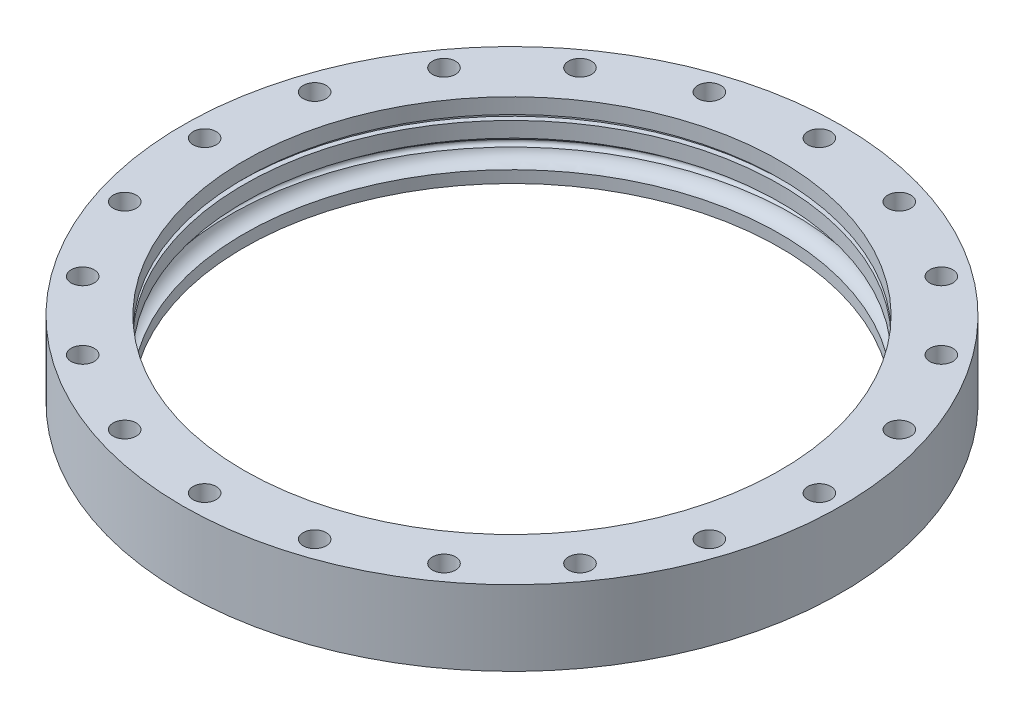
ISO-10303-21;
HEADER;
FILE_DESCRIPTION(('STEP AP214'),'2;1');
FILE_NAME('part.step','',(''),(''),'','','');
FILE_SCHEMA(('AUTOMOTIVE_DESIGN { 1 0 10303 214 1 1 1 1 }'));
ENDSEC;
DATA;
#1=APPLICATION_CONTEXT('core data for automotive mechanical design processes');
#2=APPLICATION_PROTOCOL_DEFINITION('international standard','automotive_design',2000,#1);
#3=PRODUCT_CONTEXT('',#1,'mechanical');
#4=PRODUCT('Part','Part','',(#3));
#5=PRODUCT_RELATED_PRODUCT_CATEGORY('part','',(#4));
#6=PRODUCT_DEFINITION_FORMATION('','',#4);
#7=PRODUCT_DEFINITION_CONTEXT('part definition',#1,'design');
#8=PRODUCT_DEFINITION('design','',#6,#7);
#9=PRODUCT_DEFINITION_SHAPE('','',#8);
#10=(LENGTH_UNIT() NAMED_UNIT(*) SI_UNIT(.MILLI.,.METRE.));
#11=(NAMED_UNIT(*) PLANE_ANGLE_UNIT() SI_UNIT($,.RADIAN.));
#12=(NAMED_UNIT(*) SI_UNIT($,.STERADIAN.) SOLID_ANGLE_UNIT());
#13=UNCERTAINTY_MEASURE_WITH_UNIT(LENGTH_MEASURE(1.E-05),#10,'distance_accuracy_value','');
#14=(GEOMETRIC_REPRESENTATION_CONTEXT(3) GLOBAL_UNCERTAINTY_ASSIGNED_CONTEXT((#13)) GLOBAL_UNIT_ASSIGNED_CONTEXT((#10,
#11,#12)) REPRESENTATION_CONTEXT('',''));
#15=CARTESIAN_POINT('',(0.,0.,0.));
#16=DIRECTION('',(0.,0.,1.));
#17=DIRECTION('',(1.,0.,0.));
#18=AXIS2_PLACEMENT_3D('',#15,#16,#17);
#19=CARTESIAN_POINT('',(0.,15.,0.));
#20=DIRECTION('',(0.,1.,0.));
#21=DIRECTION('',(0.,0.,1.));
#22=AXIS2_PLACEMENT_3D('',#19,#20,#21);
#23=TOROIDAL_SURFACE('',#22,164.5,2.);
#24=CARTESIAN_POINT('',(0.,13.0156865167015,0.));
#25=DIRECTION('',(0.,1.,0.));
#26=DIRECTION('',(0.,0.,1.));
#27=AXIS2_PLACEMENT_3D('',#24,#25,#26);
#28=CIRCLE('',#27,164.75);
#29=CARTESIAN_POINT('',(0.,13.0156865167015,164.75));
#30=VERTEX_POINT('',#29);
#31=EDGE_CURVE('E71',#30,#30,#28,.T.);
#32=ORIENTED_EDGE('',*,*,#31,.F.);
#33=EDGE_LOOP('',(#32));
#34=FACE_BOUND('',#33,.T.);
#35=CARTESIAN_POINT('',(0.,16.9843134832984,0.));
#36=DIRECTION('',(0.,1.,0.));
#37=DIRECTION('',(0.,0.,1.));
#38=AXIS2_PLACEMENT_3D('',#35,#36,#37);
#39=CIRCLE('',#38,164.75);
#40=CARTESIAN_POINT('',(0.,16.9843134832984,164.75));
#41=VERTEX_POINT('',#40);
#42=EDGE_CURVE('E10',#41,#41,#39,.T.);
#43=ORIENTED_EDGE('',*,*,#42,.T.);
#44=EDGE_LOOP('',(#43));
#45=FACE_BOUND('',#44,.T.);
#46=ADVANCED_FACE('F31',(#34,#45),#23,.F.);
#47=CARTESIAN_POINT('',(0.,15.,0.));
#48=DIRECTION('',(0.,1.,0.));
#49=DIRECTION('',(0.,0.,1.));
#50=AXIS2_PLACEMENT_3D('',#47,#48,#49);
#51=TOROIDAL_SURFACE('',#50,157.,8.);
#52=ORIENTED_EDGE('',*,*,#42,.F.);
#53=EDGE_LOOP('',(#52));
#54=FACE_BOUND('',#53,.T.);
#55=CARTESIAN_POINT('',(0.,23.,0.));
#56=DIRECTION('',(0.,1.,0.));
#57=DIRECTION('',(0.,0.,1.));
#58=AXIS2_PLACEMENT_3D('',#55,#56,#57);
#59=CIRCLE('',#58,157.);
#60=CARTESIAN_POINT('',(0.,23.,157.));
#61=VERTEX_POINT('',#60);
#62=EDGE_CURVE('E37',#61,#61,#59,.T.);
#63=ORIENTED_EDGE('',*,*,#62,.T.);
#64=EDGE_LOOP('',(#63));
#65=FACE_BOUND('',#64,.T.);
#66=ADVANCED_FACE('F265',(#54,#65),#51,.F.);
#67=CARTESIAN_POINT('',(0.,44.,0.));
#68=DIRECTION('',(0.,1.,0.));
#69=DIRECTION('',(0.,0.,1.));
#70=AXIS2_PLACEMENT_3D('',#67,#68,#69);
#71=CYLINDRICAL_SURFACE('',#70,157.);
#72=ORIENTED_EDGE('',*,*,#62,.F.);
#73=EDGE_LOOP('',(#72));
#74=FACE_BOUND('',#73,.T.);
#75=CARTESIAN_POINT('',(0.,32.,0.));
#76=DIRECTION('',(0.,1.,0.));
#77=DIRECTION('',(0.,0.,1.));
#78=AXIS2_PLACEMENT_3D('',#75,#76,#77);
#79=CIRCLE('',#78,157.);
#80=CARTESIAN_POINT('',(0.,32.,157.));
#81=VERTEX_POINT('',#80);
#82=EDGE_CURVE('E41',#81,#81,#79,.T.);
#83=ORIENTED_EDGE('',*,*,#82,.T.);
#84=EDGE_LOOP('',(#83));
#85=FACE_BOUND('',#84,.T.);
#86=ADVANCED_FACE('F270',(#74,#85),#71,.F.);
#87=CARTESIAN_POINT('',(0.,32.,0.));
#88=DIRECTION('',(0.,-1.,0.));
#89=DIRECTION('',(0.,0.,-1.));
#90=AXIS2_PLACEMENT_3D('',#87,#88,#89);
#91=PLANE('',#90);
#92=ORIENTED_EDGE('',*,*,#82,.F.);
#93=EDGE_LOOP('',(#92));
#94=FACE_BOUND('',#93,.T.);
#95=CARTESIAN_POINT('',(0.,32.,0.));
#96=DIRECTION('',(0.,1.,0.));
#97=DIRECTION('',(0.,0.,1.));
#98=AXIS2_PLACEMENT_3D('',#95,#96,#97);
#99=CIRCLE('',#98,160.);
#100=CARTESIAN_POINT('',(0.,32.,160.));
#101=VERTEX_POINT('',#100);
#102=EDGE_CURVE('E45',#101,#101,#99,.T.);
#103=ORIENTED_EDGE('',*,*,#102,.T.);
#104=EDGE_LOOP('',(#103));
#105=FACE_BOUND('',#104,.T.);
#106=ADVANCED_FACE('F345',(#94,#105),#91,.F.);
#107=CARTESIAN_POINT('',(0.,44.,0.));
#108=DIRECTION('',(0.,1.,0.));
#109=DIRECTION('',(0.,0.,1.));
#110=AXIS2_PLACEMENT_3D('',#107,#108,#109);
#111=CYLINDRICAL_SURFACE('',#110,160.);
#112=ORIENTED_EDGE('',*,*,#102,.F.);
#113=EDGE_LOOP('',(#112));
#114=FACE_BOUND('',#113,.T.);
#115=CARTESIAN_POINT('',(0.,35.,0.));
#116=DIRECTION('',(0.,1.,0.));
#117=DIRECTION('',(0.,0.,1.));
#118=AXIS2_PLACEMENT_3D('',#115,#116,#117);
#119=CIRCLE('',#118,160.);
#120=CARTESIAN_POINT('',(0.,35.,160.));
#121=VERTEX_POINT('',#120);
#122=EDGE_CURVE('E50',#121,#121,#119,.T.);
#123=ORIENTED_EDGE('',*,*,#122,.T.);
#124=EDGE_LOOP('',(#123));
#125=FACE_BOUND('',#124,.T.);
#126=ADVANCED_FACE('F260',(#114,#125),#111,.F.);
#127=CARTESIAN_POINT('',(0.,35.,0.));
#128=DIRECTION('',(0.,1.,0.));
#129=DIRECTION('',(0.,0.,1.));
#130=AXIS2_PLACEMENT_3D('',#127,#128,#129);
#131=PLANE('',#130);
#132=ORIENTED_EDGE('',*,*,#122,.F.);
#133=EDGE_LOOP('',(#132));
#134=FACE_BOUND('',#133,.T.);
#135=CARTESIAN_POINT('',(0.,35.,0.));
#136=DIRECTION('',(0.,1.,0.));
#137=DIRECTION('',(0.,0.,1.));
#138=AXIS2_PLACEMENT_3D('',#135,#136,#137);
#139=CIRCLE('',#138,157.);
#140=CARTESIAN_POINT('',(0.,35.,157.));
#141=VERTEX_POINT('',#140);
#142=EDGE_CURVE('E53',#141,#141,#139,.T.);
#143=ORIENTED_EDGE('',*,*,#142,.T.);
#144=EDGE_LOOP('',(#143));
#145=FACE_BOUND('',#144,.T.);
#146=ADVANCED_FACE('F254',(#134,#145),#131,.F.);
#147=CARTESIAN_POINT('',(0.,44.,0.));
#148=DIRECTION('',(0.,1.,0.));
#149=DIRECTION('',(0.,0.,1.));
#150=AXIS2_PLACEMENT_3D('',#147,#148,#149);
#151=CYLINDRICAL_SURFACE('',#150,157.);
#152=ORIENTED_EDGE('',*,*,#142,.F.);
#153=EDGE_LOOP('',(#152));
#154=FACE_BOUND('',#153,.T.);
#155=CARTESIAN_POINT('',(0.,44.,0.));
#156=DIRECTION('',(0.,1.,0.));
#157=DIRECTION('',(0.,0.,1.));
#158=AXIS2_PLACEMENT_3D('',#155,#156,#157);
#159=CIRCLE('',#158,157.);
#160=CARTESIAN_POINT('',(0.,44.,157.));
#161=VERTEX_POINT('',#160);
#162=EDGE_CURVE('E56',#161,#161,#159,.T.);
#163=ORIENTED_EDGE('',*,*,#162,.T.);
#164=EDGE_LOOP('',(#163));
#165=FACE_BOUND('',#164,.T.);
#166=ADVANCED_FACE('F209',(#154,#165),#151,.F.);
#167=CARTESIAN_POINT('',(0.,44.,0.));
#168=DIRECTION('',(0.,1.,0.));
#169=DIRECTION('',(0.,0.,1.));
#170=AXIS2_PLACEMENT_3D('',#167,#168,#169);
#171=PLANE('',#170);
#172=CARTESIAN_POINT('',(-171.190172933128,44.,55.6230589874905));
#173=DIRECTION('',(0.,1.,0.));
#174=DIRECTION('',(0.,0.,1.));
#175=AXIS2_PLACEMENT_3D('',#172,#173,#174);
#176=CIRCLE('',#175,6.75000000000052);
#177=CARTESIAN_POINT('',(-171.190172933128,44.,62.3730589874911));
#178=VERTEX_POINT('',#177);
#179=EDGE_CURVE('E189',#178,#178,#176,.T.);
#180=ORIENTED_EDGE('',*,*,#179,.F.);
#181=EDGE_LOOP('',(#180));
#182=FACE_BOUND('',#181,.T.);
#183=CARTESIAN_POINT('',(-145.62305898749,44.,105.801345412645));
#184=DIRECTION('',(0.,1.,0.));
#185=DIRECTION('',(0.,0.,1.));
#186=AXIS2_PLACEMENT_3D('',#183,#184,#185);
#187=CIRCLE('',#186,6.75);
#188=CARTESIAN_POINT('',(-145.62305898749,44.,112.551345412645));
#189=VERTEX_POINT('',#188);
#190=EDGE_CURVE('E183',#189,#189,#187,.T.);
#191=ORIENTED_EDGE('',*,*,#190,.F.);
#192=EDGE_LOOP('',(#191));
#193=FACE_BOUND('',#192,.T.);
#194=CARTESIAN_POINT('',(-105.801345412645,44.,145.62305898749));
#195=DIRECTION('',(0.,1.,0.));
#196=DIRECTION('',(0.,0.,1.));
#197=AXIS2_PLACEMENT_3D('',#194,#195,#196);
#198=CIRCLE('',#197,6.74999999999998);
#199=CARTESIAN_POINT('',(-105.801345412645,44.,152.37305898749));
#200=VERTEX_POINT('',#199);
#201=EDGE_CURVE('E177',#200,#200,#198,.T.);
#202=ORIENTED_EDGE('',*,*,#201,.F.);
#203=EDGE_LOOP('',(#202));
#204=FACE_BOUND('',#203,.T.);
#205=CARTESIAN_POINT('',(-55.6230589874904,44.,171.190172933127));
#206=DIRECTION('',(0.,1.,0.));
#207=DIRECTION('',(0.,0.,1.));
#208=AXIS2_PLACEMENT_3D('',#205,#206,#207);
#209=CIRCLE('',#208,6.75);
#210=CARTESIAN_POINT('',(-55.6230589874904,44.,177.940172933127));
#211=VERTEX_POINT('',#210);
#212=EDGE_CURVE('E171',#211,#211,#209,.T.);
#213=ORIENTED_EDGE('',*,*,#212,.F.);
#214=EDGE_LOOP('',(#213));
#215=FACE_BOUND('',#214,.T.);
#216=CARTESIAN_POINT('',(1.66533453693773E-13,44.,180.));
#217=DIRECTION('',(0.,1.,0.));
#218=DIRECTION('',(0.,0.,1.));
#219=AXIS2_PLACEMENT_3D('',#216,#217,#218);
#220=CIRCLE('',#219,6.75);
#221=CARTESIAN_POINT('',(1.66533453693773E-13,44.,186.75));
#222=VERTEX_POINT('',#221);
#223=EDGE_CURVE('E165',#222,#222,#220,.T.);
#224=ORIENTED_EDGE('',*,*,#223,.F.);
#225=EDGE_LOOP('',(#224));
#226=FACE_BOUND('',#225,.T.);
#227=CARTESIAN_POINT('',(55.6230589874907,44.,171.190172933127));
#228=DIRECTION('',(0.,1.,0.));
#229=DIRECTION('',(0.,0.,1.));
#230=AXIS2_PLACEMENT_3D('',#227,#228,#229);
#231=CIRCLE('',#230,6.75);
#232=CARTESIAN_POINT('',(55.6230589874907,44.,177.940172933127));
#233=VERTEX_POINT('',#232);
#234=EDGE_CURVE('E159',#233,#233,#231,.T.);
#235=ORIENTED_EDGE('',*,*,#234,.F.);
#236=EDGE_LOOP('',(#235));
#237=FACE_BOUND('',#236,.T.);
#238=CARTESIAN_POINT('',(105.801345412645,44.,145.62305898749));
#239=DIRECTION('',(0.,1.,0.));
#240=DIRECTION('',(0.,0.,1.));
#241=AXIS2_PLACEMENT_3D('',#238,#239,#240);
#242=CIRCLE('',#241,6.75);
#243=CARTESIAN_POINT('',(105.801345412645,44.,152.37305898749));
#244=VERTEX_POINT('',#243);
#245=EDGE_CURVE('E153',#244,#244,#242,.T.);
#246=ORIENTED_EDGE('',*,*,#245,.F.);
#247=EDGE_LOOP('',(#246));
#248=FACE_BOUND('',#247,.T.);
#249=CARTESIAN_POINT('',(145.623058987491,44.,105.801345412645));
#250=DIRECTION('',(0.,1.,0.));
#251=DIRECTION('',(0.,0.,1.));
#252=AXIS2_PLACEMENT_3D('',#249,#250,#251);
#253=CIRCLE('',#252,6.75);
#254=CARTESIAN_POINT('',(145.623058987491,44.,112.551345412645));
#255=VERTEX_POINT('',#254);
#256=EDGE_CURVE('E147',#255,#255,#253,.T.);
#257=ORIENTED_EDGE('',*,*,#256,.F.);
#258=EDGE_LOOP('',(#257));
#259=FACE_BOUND('',#258,.T.);
#260=CARTESIAN_POINT('',(171.190172933128,44.,55.6230589874901));
#261=DIRECTION('',(0.,1.,0.));
#262=DIRECTION('',(0.,0.,1.));
#263=AXIS2_PLACEMENT_3D('',#260,#261,#262);
#264=CIRCLE('',#263,6.74999999999997);
#265=CARTESIAN_POINT('',(171.190172933128,44.,62.3730589874901));
#266=VERTEX_POINT('',#265);
#267=EDGE_CURVE('E141',#266,#266,#264,.T.);
#268=ORIENTED_EDGE('',*,*,#267,.F.);
#269=EDGE_LOOP('',(#268));
#270=FACE_BOUND('',#269,.T.);
#271=CARTESIAN_POINT('',(180.,44.,-3.88578058618805E-13));
#272=DIRECTION('',(0.,1.,0.));
#273=DIRECTION('',(0.,0.,1.));
#274=AXIS2_PLACEMENT_3D('',#271,#272,#273);
#275=CIRCLE('',#274,6.74999999999997);
#276=CARTESIAN_POINT('',(180.,44.,6.74999999999958));
#277=VERTEX_POINT('',#276);
#278=EDGE_CURVE('E135',#277,#277,#275,.T.);
#279=ORIENTED_EDGE('',*,*,#278,.F.);
#280=EDGE_LOOP('',(#279));
#281=FACE_BOUND('',#280,.T.);
#282=CARTESIAN_POINT('',(171.190172933127,44.,-55.6230589874909));
#283=DIRECTION('',(0.,1.,0.));
#284=DIRECTION('',(0.,0.,1.));
#285=AXIS2_PLACEMENT_3D('',#282,#283,#284);
#286=CIRCLE('',#285,6.75);
#287=CARTESIAN_POINT('',(171.190172933127,44.,-48.8730589874909));
#288=VERTEX_POINT('',#287);
#289=EDGE_CURVE('E129',#288,#288,#286,.T.);
#290=ORIENTED_EDGE('',*,*,#289,.F.);
#291=EDGE_LOOP('',(#290));
#292=FACE_BOUND('',#291,.T.);
#293=CARTESIAN_POINT('',(145.62305898749,44.,-105.801345412646));
#294=DIRECTION('',(0.,1.,0.));
#295=DIRECTION('',(0.,0.,1.));
#296=AXIS2_PLACEMENT_3D('',#293,#294,#295);
#297=CIRCLE('',#296,6.75);
#298=CARTESIAN_POINT('',(145.62305898749,44.,-99.0513454126455));
#299=VERTEX_POINT('',#298);
#300=EDGE_CURVE('E123',#299,#299,#297,.T.);
#301=ORIENTED_EDGE('',*,*,#300,.F.);
#302=EDGE_LOOP('',(#301));
#303=FACE_BOUND('',#302,.T.);
#304=CARTESIAN_POINT('',(105.801345412645,44.,-145.623058987491));
#305=DIRECTION('',(0.,1.,0.));
#306=DIRECTION('',(0.,0.,1.));
#307=AXIS2_PLACEMENT_3D('',#304,#305,#306);
#308=CIRCLE('',#307,6.75000000000003);
#309=CARTESIAN_POINT('',(105.801345412645,44.,-138.873058987491));
#310=VERTEX_POINT('',#309);
#311=EDGE_CURVE('E117',#310,#310,#308,.T.);
#312=ORIENTED_EDGE('',*,*,#311,.F.);
#313=EDGE_LOOP('',(#312));
#314=FACE_BOUND('',#313,.T.);
#315=CARTESIAN_POINT('',(55.6230589874902,44.,-171.190172933128));
#316=DIRECTION('',(0.,1.,0.));
#317=DIRECTION('',(0.,0.,1.));
#318=AXIS2_PLACEMENT_3D('',#315,#316,#317);
#319=CIRCLE('',#318,6.74999999999998);
#320=CARTESIAN_POINT('',(55.6230589874902,44.,-164.440172933128));
#321=VERTEX_POINT('',#320);
#322=EDGE_CURVE('E111',#321,#321,#319,.T.);
#323=ORIENTED_EDGE('',*,*,#322,.F.);
#324=EDGE_LOOP('',(#323));
#325=FACE_BOUND('',#324,.T.);
#326=CARTESIAN_POINT('',(-2.77555756156289E-13,44.,-180.));
#327=DIRECTION('',(0.,1.,0.));
#328=DIRECTION('',(0.,0.,1.));
#329=AXIS2_PLACEMENT_3D('',#326,#327,#328);
#330=CIRCLE('',#329,6.74999999999999);
#331=CARTESIAN_POINT('',(-2.77555756156289E-13,44.,-173.25));
#332=VERTEX_POINT('',#331);
#333=EDGE_CURVE('E105',#332,#332,#330,.T.);
#334=ORIENTED_EDGE('',*,*,#333,.F.);
#335=EDGE_LOOP('',(#334));
#336=FACE_BOUND('',#335,.T.);
#337=CARTESIAN_POINT('',(-55.6230589874908,44.,-171.190172933128));
#338=DIRECTION('',(0.,1.,0.));
#339=DIRECTION('',(0.,0.,1.));
#340=AXIS2_PLACEMENT_3D('',#337,#338,#339);
#341=CIRCLE('',#340,6.75000000000003);
#342=CARTESIAN_POINT('',(-55.6230589874908,44.,-164.440172933128));
#343=VERTEX_POINT('',#342);
#344=EDGE_CURVE('E99',#343,#343,#341,.T.);
#345=ORIENTED_EDGE('',*,*,#344,.F.);
#346=EDGE_LOOP('',(#345));
#347=FACE_BOUND('',#346,.T.);
#348=CARTESIAN_POINT('',(-105.801345412645,44.,-145.623058987491));
#349=DIRECTION('',(0.,1.,0.));
#350=DIRECTION('',(0.,0.,1.));
#351=AXIS2_PLACEMENT_3D('',#348,#349,#350);
#352=CIRCLE('',#351,6.75);
#353=CARTESIAN_POINT('',(-105.801345412645,44.,-138.873058987491));
#354=VERTEX_POINT('',#353);
#355=EDGE_CURVE('E93',#354,#354,#352,.T.);
#356=ORIENTED_EDGE('',*,*,#355,.F.);
#357=EDGE_LOOP('',(#356));
#358=FACE_BOUND('',#357,.T.);
#359=CARTESIAN_POINT('',(-145.623058987491,44.,-105.801345412645));
#360=DIRECTION('',(0.,1.,0.));
#361=DIRECTION('',(0.,0.,1.));
#362=AXIS2_PLACEMENT_3D('',#359,#360,#361);
#363=CIRCLE('',#362,6.75);
#364=CARTESIAN_POINT('',(-145.623058987491,44.,-99.0513454126451));
#365=VERTEX_POINT('',#364);
#366=EDGE_CURVE('E87',#365,#365,#363,.T.);
#367=ORIENTED_EDGE('',*,*,#366,.F.);
#368=EDGE_LOOP('',(#367));
#369=FACE_BOUND('',#368,.T.);
#370=CARTESIAN_POINT('',(-171.190172933128,44.,-55.6230589874905));
#371=DIRECTION('',(0.,1.,0.));
#372=DIRECTION('',(0.,0.,1.));
#373=AXIS2_PLACEMENT_3D('',#370,#371,#372);
#374=CIRCLE('',#373,6.75);
#375=CARTESIAN_POINT('',(-171.190172933128,44.,-48.8730589874905));
#376=VERTEX_POINT('',#375);
#377=EDGE_CURVE('E81',#376,#376,#374,.T.);
#378=ORIENTED_EDGE('',*,*,#377,.F.);
#379=EDGE_LOOP('',(#378));
#380=FACE_BOUND('',#379,.T.);
#381=CARTESIAN_POINT('',(-180.,44.,0.));
#382=DIRECTION('',(0.,1.,0.));
#383=DIRECTION('',(0.,0.,1.));
#384=AXIS2_PLACEMENT_3D('',#381,#382,#383);
#385=CIRCLE('',#384,6.75);
#386=CARTESIAN_POINT('',(-180.,44.,6.75000000000002));
#387=VERTEX_POINT('',#386);
#388=EDGE_CURVE('E75',#387,#387,#385,.T.);
#389=ORIENTED_EDGE('',*,*,#388,.F.);
#390=EDGE_LOOP('',(#389));
#391=FACE_BOUND('',#390,.T.);
#392=CARTESIAN_POINT('',(0.,44.,0.));
#393=DIRECTION('',(0.,1.,0.));
#394=DIRECTION('',(0.,0.,1.));
#395=AXIS2_PLACEMENT_3D('',#392,#393,#394);
#396=CIRCLE('',#395,193.);
#397=CARTESIAN_POINT('',(0.,44.,193.));
#398=VERTEX_POINT('',#397);
#399=EDGE_CURVE('E59',#398,#398,#396,.T.);
#400=ORIENTED_EDGE('',*,*,#399,.T.);
#401=EDGE_LOOP('',(#400));
#402=FACE_BOUND('',#401,.T.);
#403=ORIENTED_EDGE('',*,*,#162,.F.);
#404=EDGE_LOOP('',(#403));
#405=FACE_BOUND('',#404,.T.);
#406=ADVANCED_FACE('F205',(#182,#193,#204,#215,#226,#237,#248,#259,#270,#281,#292,#303,#314,
#325,#336,#347,#358,#369,#380,#391,#402,#405),#171,.T.);
#407=CARTESIAN_POINT('',(0.,44.,0.));
#408=DIRECTION('',(0.,1.,0.));
#409=DIRECTION('',(0.,0.,1.));
#410=AXIS2_PLACEMENT_3D('',#407,#408,#409);
#411=CYLINDRICAL_SURFACE('',#410,193.);
#412=ORIENTED_EDGE('',*,*,#399,.F.);
#413=EDGE_LOOP('',(#412));
#414=FACE_BOUND('',#413,.T.);
#415=CARTESIAN_POINT('',(0.,0.,0.));
#416=DIRECTION('',(0.,1.,0.));
#417=DIRECTION('',(0.,0.,1.));
#418=AXIS2_PLACEMENT_3D('',#415,#416,#417);
#419=CIRCLE('',#418,193.);
#420=CARTESIAN_POINT('',(0.,0.,193.));
#421=VERTEX_POINT('',#420);
#422=EDGE_CURVE('E62',#421,#421,#419,.T.);
#423=ORIENTED_EDGE('',*,*,#422,.T.);
#424=EDGE_LOOP('',(#423));
#425=FACE_BOUND('',#424,.T.);
#426=ADVANCED_FACE('F208',(#414,#425),#411,.T.);
#427=CARTESIAN_POINT('',(0.,0.,0.));
#428=DIRECTION('',(0.,-1.,0.));
#429=DIRECTION('',(0.,0.,-1.));
#430=AXIS2_PLACEMENT_3D('',#427,#428,#429);
#431=PLANE('',#430);
#432=CARTESIAN_POINT('',(-171.190172933128,0.,55.6230589874905));
#433=DIRECTION('',(0.,1.,0.));
#434=DIRECTION('',(0.,0.,1.));
#435=AXIS2_PLACEMENT_3D('',#432,#433,#434);
#436=CIRCLE('',#435,6.75000000000052);
#437=CARTESIAN_POINT('',(-171.190172933128,0.,62.3730589874911));
#438=VERTEX_POINT('',#437);
#439=EDGE_CURVE('E186',#438,#438,#436,.T.);
#440=ORIENTED_EDGE('',*,*,#439,.T.);
#441=EDGE_LOOP('',(#440));
#442=FACE_BOUND('',#441,.T.);
#443=CARTESIAN_POINT('',(-145.62305898749,0.,105.801345412645));
#444=DIRECTION('',(0.,1.,0.));
#445=DIRECTION('',(0.,0.,1.));
#446=AXIS2_PLACEMENT_3D('',#443,#444,#445);
#447=CIRCLE('',#446,6.75);
#448=CARTESIAN_POINT('',(-145.62305898749,0.,112.551345412645));
#449=VERTEX_POINT('',#448);
#450=EDGE_CURVE('E180',#449,#449,#447,.T.);
#451=ORIENTED_EDGE('',*,*,#450,.T.);
#452=EDGE_LOOP('',(#451));
#453=FACE_BOUND('',#452,.T.);
#454=CARTESIAN_POINT('',(-105.801345412645,0.,145.62305898749));
#455=DIRECTION('',(0.,1.,0.));
#456=DIRECTION('',(0.,0.,1.));
#457=AXIS2_PLACEMENT_3D('',#454,#455,#456);
#458=CIRCLE('',#457,6.74999999999998);
#459=CARTESIAN_POINT('',(-105.801345412645,0.,152.37305898749));
#460=VERTEX_POINT('',#459);
#461=EDGE_CURVE('E174',#460,#460,#458,.T.);
#462=ORIENTED_EDGE('',*,*,#461,.T.);
#463=EDGE_LOOP('',(#462));
#464=FACE_BOUND('',#463,.T.);
#465=CARTESIAN_POINT('',(-55.6230589874904,0.,171.190172933127));
#466=DIRECTION('',(0.,1.,0.));
#467=DIRECTION('',(0.,0.,1.));
#468=AXIS2_PLACEMENT_3D('',#465,#466,#467);
#469=CIRCLE('',#468,6.75);
#470=CARTESIAN_POINT('',(-55.6230589874904,0.,177.940172933127));
#471=VERTEX_POINT('',#470);
#472=EDGE_CURVE('E168',#471,#471,#469,.T.);
#473=ORIENTED_EDGE('',*,*,#472,.T.);
#474=EDGE_LOOP('',(#473));
#475=FACE_BOUND('',#474,.T.);
#476=CARTESIAN_POINT('',(1.66533453693773E-13,0.,180.));
#477=DIRECTION('',(0.,1.,0.));
#478=DIRECTION('',(0.,0.,1.));
#479=AXIS2_PLACEMENT_3D('',#476,#477,#478);
#480=CIRCLE('',#479,6.75);
#481=CARTESIAN_POINT('',(1.66533453693773E-13,0.,186.75));
#482=VERTEX_POINT('',#481);
#483=EDGE_CURVE('E162',#482,#482,#480,.T.);
#484=ORIENTED_EDGE('',*,*,#483,.T.);
#485=EDGE_LOOP('',(#484));
#486=FACE_BOUND('',#485,.T.);
#487=CARTESIAN_POINT('',(55.6230589874907,0.,171.190172933127));
#488=DIRECTION('',(0.,1.,0.));
#489=DIRECTION('',(0.,0.,1.));
#490=AXIS2_PLACEMENT_3D('',#487,#488,#489);
#491=CIRCLE('',#490,6.75);
#492=CARTESIAN_POINT('',(55.6230589874907,0.,177.940172933127));
#493=VERTEX_POINT('',#492);
#494=EDGE_CURVE('E156',#493,#493,#491,.T.);
#495=ORIENTED_EDGE('',*,*,#494,.T.);
#496=EDGE_LOOP('',(#495));
#497=FACE_BOUND('',#496,.T.);
#498=CARTESIAN_POINT('',(105.801345412645,0.,145.62305898749));
#499=DIRECTION('',(0.,1.,0.));
#500=DIRECTION('',(0.,0.,1.));
#501=AXIS2_PLACEMENT_3D('',#498,#499,#500);
#502=CIRCLE('',#501,6.75);
#503=CARTESIAN_POINT('',(105.801345412645,0.,152.37305898749));
#504=VERTEX_POINT('',#503);
#505=EDGE_CURVE('E150',#504,#504,#502,.T.);
#506=ORIENTED_EDGE('',*,*,#505,.T.);
#507=EDGE_LOOP('',(#506));
#508=FACE_BOUND('',#507,.T.);
#509=CARTESIAN_POINT('',(145.623058987491,0.,105.801345412645));
#510=DIRECTION('',(0.,1.,0.));
#511=DIRECTION('',(0.,0.,1.));
#512=AXIS2_PLACEMENT_3D('',#509,#510,#511);
#513=CIRCLE('',#512,6.75);
#514=CARTESIAN_POINT('',(145.623058987491,0.,112.551345412645));
#515=VERTEX_POINT('',#514);
#516=EDGE_CURVE('E144',#515,#515,#513,.T.);
#517=ORIENTED_EDGE('',*,*,#516,.T.);
#518=EDGE_LOOP('',(#517));
#519=FACE_BOUND('',#518,.T.);
#520=CARTESIAN_POINT('',(171.190172933128,0.,55.6230589874901));
#521=DIRECTION('',(0.,1.,0.));
#522=DIRECTION('',(0.,0.,1.));
#523=AXIS2_PLACEMENT_3D('',#520,#521,#522);
#524=CIRCLE('',#523,6.74999999999997);
#525=CARTESIAN_POINT('',(171.190172933128,0.,62.3730589874901));
#526=VERTEX_POINT('',#525);
#527=EDGE_CURVE('E138',#526,#526,#524,.T.);
#528=ORIENTED_EDGE('',*,*,#527,.T.);
#529=EDGE_LOOP('',(#528));
#530=FACE_BOUND('',#529,.T.);
#531=CARTESIAN_POINT('',(180.,0.,-3.88578058618805E-13));
#532=DIRECTION('',(0.,1.,0.));
#533=DIRECTION('',(0.,0.,1.));
#534=AXIS2_PLACEMENT_3D('',#531,#532,#533);
#535=CIRCLE('',#534,6.74999999999997);
#536=CARTESIAN_POINT('',(180.,0.,6.74999999999958));
#537=VERTEX_POINT('',#536);
#538=EDGE_CURVE('E132',#537,#537,#535,.T.);
#539=ORIENTED_EDGE('',*,*,#538,.T.);
#540=EDGE_LOOP('',(#539));
#541=FACE_BOUND('',#540,.T.);
#542=CARTESIAN_POINT('',(171.190172933127,0.,-55.6230589874909));
#543=DIRECTION('',(0.,1.,0.));
#544=DIRECTION('',(0.,0.,1.));
#545=AXIS2_PLACEMENT_3D('',#542,#543,#544);
#546=CIRCLE('',#545,6.75);
#547=CARTESIAN_POINT('',(171.190172933127,0.,-48.8730589874909));
#548=VERTEX_POINT('',#547);
#549=EDGE_CURVE('E126',#548,#548,#546,.T.);
#550=ORIENTED_EDGE('',*,*,#549,.T.);
#551=EDGE_LOOP('',(#550));
#552=FACE_BOUND('',#551,.T.);
#553=CARTESIAN_POINT('',(145.62305898749,0.,-105.801345412646));
#554=DIRECTION('',(0.,1.,0.));
#555=DIRECTION('',(0.,0.,1.));
#556=AXIS2_PLACEMENT_3D('',#553,#554,#555);
#557=CIRCLE('',#556,6.75);
#558=CARTESIAN_POINT('',(145.62305898749,0.,-99.0513454126455));
#559=VERTEX_POINT('',#558);
#560=EDGE_CURVE('E120',#559,#559,#557,.T.);
#561=ORIENTED_EDGE('',*,*,#560,.T.);
#562=EDGE_LOOP('',(#561));
#563=FACE_BOUND('',#562,.T.);
#564=CARTESIAN_POINT('',(105.801345412645,0.,-145.623058987491));
#565=DIRECTION('',(0.,1.,0.));
#566=DIRECTION('',(0.,0.,1.));
#567=AXIS2_PLACEMENT_3D('',#564,#565,#566);
#568=CIRCLE('',#567,6.75000000000003);
#569=CARTESIAN_POINT('',(105.801345412645,0.,-138.873058987491));
#570=VERTEX_POINT('',#569);
#571=EDGE_CURVE('E114',#570,#570,#568,.T.);
#572=ORIENTED_EDGE('',*,*,#571,.T.);
#573=EDGE_LOOP('',(#572));
#574=FACE_BOUND('',#573,.T.);
#575=CARTESIAN_POINT('',(55.6230589874902,0.,-171.190172933128));
#576=DIRECTION('',(0.,1.,0.));
#577=DIRECTION('',(0.,0.,1.));
#578=AXIS2_PLACEMENT_3D('',#575,#576,#577);
#579=CIRCLE('',#578,6.74999999999998);
#580=CARTESIAN_POINT('',(55.6230589874902,0.,-164.440172933128));
#581=VERTEX_POINT('',#580);
#582=EDGE_CURVE('E108',#581,#581,#579,.T.);
#583=ORIENTED_EDGE('',*,*,#582,.T.);
#584=EDGE_LOOP('',(#583));
#585=FACE_BOUND('',#584,.T.);
#586=CARTESIAN_POINT('',(-2.77555756156289E-13,0.,-180.));
#587=DIRECTION('',(0.,1.,0.));
#588=DIRECTION('',(0.,0.,1.));
#589=AXIS2_PLACEMENT_3D('',#586,#587,#588);
#590=CIRCLE('',#589,6.74999999999999);
#591=CARTESIAN_POINT('',(-2.77555756156289E-13,0.,-173.25));
#592=VERTEX_POINT('',#591);
#593=EDGE_CURVE('E102',#592,#592,#590,.T.);
#594=ORIENTED_EDGE('',*,*,#593,.T.);
#595=EDGE_LOOP('',(#594));
#596=FACE_BOUND('',#595,.T.);
#597=CARTESIAN_POINT('',(-55.6230589874908,0.,-171.190172933128));
#598=DIRECTION('',(0.,1.,0.));
#599=DIRECTION('',(0.,0.,1.));
#600=AXIS2_PLACEMENT_3D('',#597,#598,#599);
#601=CIRCLE('',#600,6.75000000000003);
#602=CARTESIAN_POINT('',(-55.6230589874908,0.,-164.440172933128));
#603=VERTEX_POINT('',#602);
#604=EDGE_CURVE('E96',#603,#603,#601,.T.);
#605=ORIENTED_EDGE('',*,*,#604,.T.);
#606=EDGE_LOOP('',(#605));
#607=FACE_BOUND('',#606,.T.);
#608=CARTESIAN_POINT('',(-105.801345412645,0.,-145.623058987491));
#609=DIRECTION('',(0.,1.,0.));
#610=DIRECTION('',(0.,0.,1.));
#611=AXIS2_PLACEMENT_3D('',#608,#609,#610);
#612=CIRCLE('',#611,6.75);
#613=CARTESIAN_POINT('',(-105.801345412645,0.,-138.873058987491));
#614=VERTEX_POINT('',#613);
#615=EDGE_CURVE('E90',#614,#614,#612,.T.);
#616=ORIENTED_EDGE('',*,*,#615,.T.);
#617=EDGE_LOOP('',(#616));
#618=FACE_BOUND('',#617,.T.);
#619=CARTESIAN_POINT('',(-145.623058987491,0.,-105.801345412645));
#620=DIRECTION('',(0.,1.,0.));
#621=DIRECTION('',(0.,0.,1.));
#622=AXIS2_PLACEMENT_3D('',#619,#620,#621);
#623=CIRCLE('',#622,6.75);
#624=CARTESIAN_POINT('',(-145.623058987491,0.,-99.0513454126451));
#625=VERTEX_POINT('',#624);
#626=EDGE_CURVE('E84',#625,#625,#623,.T.);
#627=ORIENTED_EDGE('',*,*,#626,.T.);
#628=EDGE_LOOP('',(#627));
#629=FACE_BOUND('',#628,.T.);
#630=CARTESIAN_POINT('',(-171.190172933128,0.,-55.6230589874905));
#631=DIRECTION('',(0.,1.,0.));
#632=DIRECTION('',(0.,0.,1.));
#633=AXIS2_PLACEMENT_3D('',#630,#631,#632);
#634=CIRCLE('',#633,6.75);
#635=CARTESIAN_POINT('',(-171.190172933128,0.,-48.8730589874905));
#636=VERTEX_POINT('',#635);
#637=EDGE_CURVE('E78',#636,#636,#634,.T.);
#638=ORIENTED_EDGE('',*,*,#637,.T.);
#639=EDGE_LOOP('',(#638));
#640=FACE_BOUND('',#639,.T.);
#641=CARTESIAN_POINT('',(-180.,0.,0.));
#642=DIRECTION('',(0.,1.,0.));
#643=DIRECTION('',(0.,0.,1.));
#644=AXIS2_PLACEMENT_3D('',#641,#642,#643);
#645=CIRCLE('',#644,6.75);
#646=CARTESIAN_POINT('',(-180.,0.,6.75000000000002));
#647=VERTEX_POINT('',#646);
#648=EDGE_CURVE('E74',#647,#647,#645,.T.);
#649=ORIENTED_EDGE('',*,*,#648,.T.);
#650=EDGE_LOOP('',(#649));
#651=FACE_BOUND('',#650,.T.);
#652=CARTESIAN_POINT('',(0.,0.,0.));
#653=DIRECTION('',(0.,1.,0.));
#654=DIRECTION('',(0.,0.,1.));
#655=AXIS2_PLACEMENT_3D('',#652,#653,#654);
#656=CIRCLE('',#655,157.);
#657=CARTESIAN_POINT('',(0.,0.,157.));
#658=VERTEX_POINT('',#657);
#659=EDGE_CURVE('E65',#658,#658,#656,.T.);
#660=ORIENTED_EDGE('',*,*,#659,.T.);
#661=EDGE_LOOP('',(#660));
#662=FACE_BOUND('',#661,.T.);
#663=ORIENTED_EDGE('',*,*,#422,.F.);
#664=EDGE_LOOP('',(#663));
#665=FACE_BOUND('',#664,.T.);
#666=ADVANCED_FACE('F195',(#442,#453,#464,#475,#486,#497,#508,#519,#530,#541,#552,#563,#574,
#585,#596,#607,#618,#629,#640,#651,#662,#665),#431,.T.);
#667=CARTESIAN_POINT('',(0.,44.,0.));
#668=DIRECTION('',(0.,1.,0.));
#669=DIRECTION('',(0.,0.,1.));
#670=AXIS2_PLACEMENT_3D('',#667,#668,#669);
#671=CYLINDRICAL_SURFACE('',#670,157.);
#672=CARTESIAN_POINT('',(0.,6.99999999999999,0.));
#673=DIRECTION('',(0.,1.,0.));
#674=DIRECTION('',(0.,0.,1.));
#675=AXIS2_PLACEMENT_3D('',#672,#673,#674);
#676=CIRCLE('',#675,157.);
#677=CARTESIAN_POINT('',(0.,6.99999999999999,157.));
#678=VERTEX_POINT('',#677);
#679=EDGE_CURVE('E68',#678,#678,#676,.T.);
#680=ORIENTED_EDGE('',*,*,#679,.T.);
#681=EDGE_LOOP('',(#680));
#682=FACE_BOUND('',#681,.T.);
#683=ORIENTED_EDGE('',*,*,#659,.F.);
#684=EDGE_LOOP('',(#683));
#685=FACE_BOUND('',#684,.T.);
#686=ADVANCED_FACE('F278',(#682,#685),#671,.F.);
#687=ORIENTED_EDGE('',*,*,#679,.F.);
#688=EDGE_LOOP('',(#687));
#689=FACE_BOUND('',#688,.T.);
#690=ORIENTED_EDGE('',*,*,#31,.T.);
#691=EDGE_LOOP('',(#690));
#692=FACE_BOUND('',#691,.T.);
#693=ADVANCED_FACE('F273',(#689,#692),#51,.F.);
#694=CARTESIAN_POINT('',(-180.,0.,0.));
#695=DIRECTION('',(0.,1.,0.));
#696=DIRECTION('',(0.,0.,1.));
#697=AXIS2_PLACEMENT_3D('',#694,#695,#696);
#698=CYLINDRICAL_SURFACE('',#697,6.75);
#699=ORIENTED_EDGE('',*,*,#648,.F.);
#700=EDGE_LOOP('',(#699));
#701=FACE_BOUND('',#700,.T.);
#702=ORIENTED_EDGE('',*,*,#388,.T.);
#703=EDGE_LOOP('',(#702));
#704=FACE_BOUND('',#703,.T.);
#705=ADVANCED_FACE('F277',(#701,#704),#698,.F.);
#706=CARTESIAN_POINT('',(-171.190172933128,0.,-55.6230589874905));
#707=DIRECTION('',(0.,1.,0.));
#708=DIRECTION('',(0.,0.,1.));
#709=AXIS2_PLACEMENT_3D('',#706,#707,#708);
#710=CYLINDRICAL_SURFACE('',#709,6.75);
#711=ORIENTED_EDGE('',*,*,#637,.F.);
#712=EDGE_LOOP('',(#711));
#713=FACE_BOUND('',#712,.T.);
#714=ORIENTED_EDGE('',*,*,#377,.T.);
#715=EDGE_LOOP('',(#714));
#716=FACE_BOUND('',#715,.T.);
#717=ADVANCED_FACE('F284',(#713,#716),#710,.F.);
#718=CARTESIAN_POINT('',(-145.623058987491,0.,-105.801345412645));
#719=DIRECTION('',(0.,1.,0.));
#720=DIRECTION('',(0.,0.,1.));
#721=AXIS2_PLACEMENT_3D('',#718,#719,#720);
#722=CYLINDRICAL_SURFACE('',#721,6.75);
#723=ORIENTED_EDGE('',*,*,#626,.F.);
#724=EDGE_LOOP('',(#723));
#725=FACE_BOUND('',#724,.T.);
#726=ORIENTED_EDGE('',*,*,#366,.T.);
#727=EDGE_LOOP('',(#726));
#728=FACE_BOUND('',#727,.T.);
#729=ADVANCED_FACE('F398',(#725,#728),#722,.F.);
#730=CARTESIAN_POINT('',(-105.801345412645,0.,-145.623058987491));
#731=DIRECTION('',(0.,1.,0.));
#732=DIRECTION('',(0.,0.,1.));
#733=AXIS2_PLACEMENT_3D('',#730,#731,#732);
#734=CYLINDRICAL_SURFACE('',#733,6.75);
#735=ORIENTED_EDGE('',*,*,#615,.F.);
#736=EDGE_LOOP('',(#735));
#737=FACE_BOUND('',#736,.T.);
#738=ORIENTED_EDGE('',*,*,#355,.T.);
#739=EDGE_LOOP('',(#738));
#740=FACE_BOUND('',#739,.T.);
#741=ADVANCED_FACE('F406',(#737,#740),#734,.F.);
#742=CARTESIAN_POINT('',(-55.6230589874908,0.,-171.190172933128));
#743=DIRECTION('',(0.,1.,0.));
#744=DIRECTION('',(0.,0.,1.));
#745=AXIS2_PLACEMENT_3D('',#742,#743,#744);
#746=CYLINDRICAL_SURFACE('',#745,6.75000000000003);
#747=ORIENTED_EDGE('',*,*,#604,.F.);
#748=EDGE_LOOP('',(#747));
#749=FACE_BOUND('',#748,.T.);
#750=ORIENTED_EDGE('',*,*,#344,.T.);
#751=EDGE_LOOP('',(#750));
#752=FACE_BOUND('',#751,.T.);
#753=ADVANCED_FACE('F415',(#749,#752),#746,.F.);
#754=CARTESIAN_POINT('',(-2.77555756156289E-13,0.,-180.));
#755=DIRECTION('',(0.,1.,0.));
#756=DIRECTION('',(0.,0.,1.));
#757=AXIS2_PLACEMENT_3D('',#754,#755,#756);
#758=CYLINDRICAL_SURFACE('',#757,6.74999999999999);
#759=ORIENTED_EDGE('',*,*,#593,.F.);
#760=EDGE_LOOP('',(#759));
#761=FACE_BOUND('',#760,.T.);
#762=ORIENTED_EDGE('',*,*,#333,.T.);
#763=EDGE_LOOP('',(#762));
#764=FACE_BOUND('',#763,.T.);
#765=ADVANCED_FACE('F424',(#761,#764),#758,.F.);
#766=CARTESIAN_POINT('',(55.6230589874902,0.,-171.190172933128));
#767=DIRECTION('',(0.,1.,0.));
#768=DIRECTION('',(0.,0.,1.));
#769=AXIS2_PLACEMENT_3D('',#766,#767,#768);
#770=CYLINDRICAL_SURFACE('',#769,6.74999999999998);
#771=ORIENTED_EDGE('',*,*,#582,.F.);
#772=EDGE_LOOP('',(#771));
#773=FACE_BOUND('',#772,.T.);
#774=ORIENTED_EDGE('',*,*,#322,.T.);
#775=EDGE_LOOP('',(#774));
#776=FACE_BOUND('',#775,.T.);
#777=ADVANCED_FACE('F433',(#773,#776),#770,.F.);
#778=CARTESIAN_POINT('',(105.801345412645,0.,-145.623058987491));
#779=DIRECTION('',(0.,1.,0.));
#780=DIRECTION('',(0.,0.,1.));
#781=AXIS2_PLACEMENT_3D('',#778,#779,#780);
#782=CYLINDRICAL_SURFACE('',#781,6.75000000000003);
#783=ORIENTED_EDGE('',*,*,#571,.F.);
#784=EDGE_LOOP('',(#783));
#785=FACE_BOUND('',#784,.T.);
#786=ORIENTED_EDGE('',*,*,#311,.T.);
#787=EDGE_LOOP('',(#786));
#788=FACE_BOUND('',#787,.T.);
#789=ADVANCED_FACE('F442',(#785,#788),#782,.F.);
#790=CARTESIAN_POINT('',(145.62305898749,0.,-105.801345412646));
#791=DIRECTION('',(0.,1.,0.));
#792=DIRECTION('',(0.,0.,1.));
#793=AXIS2_PLACEMENT_3D('',#790,#791,#792);
#794=CYLINDRICAL_SURFACE('',#793,6.75);
#795=ORIENTED_EDGE('',*,*,#560,.F.);
#796=EDGE_LOOP('',(#795));
#797=FACE_BOUND('',#796,.T.);
#798=ORIENTED_EDGE('',*,*,#300,.T.);
#799=EDGE_LOOP('',(#798));
#800=FACE_BOUND('',#799,.T.);
#801=ADVANCED_FACE('F451',(#797,#800),#794,.F.);
#802=CARTESIAN_POINT('',(171.190172933127,0.,-55.6230589874909));
#803=DIRECTION('',(0.,1.,0.));
#804=DIRECTION('',(0.,0.,1.));
#805=AXIS2_PLACEMENT_3D('',#802,#803,#804);
#806=CYLINDRICAL_SURFACE('',#805,6.75);
#807=ORIENTED_EDGE('',*,*,#549,.F.);
#808=EDGE_LOOP('',(#807));
#809=FACE_BOUND('',#808,.T.);
#810=ORIENTED_EDGE('',*,*,#289,.T.);
#811=EDGE_LOOP('',(#810));
#812=FACE_BOUND('',#811,.T.);
#813=ADVANCED_FACE('F460',(#809,#812),#806,.F.);
#814=CARTESIAN_POINT('',(180.,0.,-3.88578058618805E-13));
#815=DIRECTION('',(0.,1.,0.));
#816=DIRECTION('',(0.,0.,1.));
#817=AXIS2_PLACEMENT_3D('',#814,#815,#816);
#818=CYLINDRICAL_SURFACE('',#817,6.74999999999997);
#819=ORIENTED_EDGE('',*,*,#538,.F.);
#820=EDGE_LOOP('',(#819));
#821=FACE_BOUND('',#820,.T.);
#822=ORIENTED_EDGE('',*,*,#278,.T.);
#823=EDGE_LOOP('',(#822));
#824=FACE_BOUND('',#823,.T.);
#825=ADVANCED_FACE('F469',(#821,#824),#818,.F.);
#826=CARTESIAN_POINT('',(171.190172933128,0.,55.6230589874901));
#827=DIRECTION('',(0.,1.,0.));
#828=DIRECTION('',(0.,0.,1.));
#829=AXIS2_PLACEMENT_3D('',#826,#827,#828);
#830=CYLINDRICAL_SURFACE('',#829,6.74999999999997);
#831=ORIENTED_EDGE('',*,*,#527,.F.);
#832=EDGE_LOOP('',(#831));
#833=FACE_BOUND('',#832,.T.);
#834=ORIENTED_EDGE('',*,*,#267,.T.);
#835=EDGE_LOOP('',(#834));
#836=FACE_BOUND('',#835,.T.);
#837=ADVANCED_FACE('F478',(#833,#836),#830,.F.);
#838=CARTESIAN_POINT('',(145.623058987491,0.,105.801345412645));
#839=DIRECTION('',(0.,1.,0.));
#840=DIRECTION('',(0.,0.,1.));
#841=AXIS2_PLACEMENT_3D('',#838,#839,#840);
#842=CYLINDRICAL_SURFACE('',#841,6.75);
#843=ORIENTED_EDGE('',*,*,#516,.F.);
#844=EDGE_LOOP('',(#843));
#845=FACE_BOUND('',#844,.T.);
#846=ORIENTED_EDGE('',*,*,#256,.T.);
#847=EDGE_LOOP('',(#846));
#848=FACE_BOUND('',#847,.T.);
#849=ADVANCED_FACE('F487',(#845,#848),#842,.F.);
#850=CARTESIAN_POINT('',(105.801345412645,0.,145.62305898749));
#851=DIRECTION('',(0.,1.,0.));
#852=DIRECTION('',(0.,0.,1.));
#853=AXIS2_PLACEMENT_3D('',#850,#851,#852);
#854=CYLINDRICAL_SURFACE('',#853,6.75);
#855=ORIENTED_EDGE('',*,*,#505,.F.);
#856=EDGE_LOOP('',(#855));
#857=FACE_BOUND('',#856,.T.);
#858=ORIENTED_EDGE('',*,*,#245,.T.);
#859=EDGE_LOOP('',(#858));
#860=FACE_BOUND('',#859,.T.);
#861=ADVANCED_FACE('F496',(#857,#860),#854,.F.);
#862=CARTESIAN_POINT('',(55.6230589874907,0.,171.190172933127));
#863=DIRECTION('',(0.,1.,0.));
#864=DIRECTION('',(0.,0.,1.));
#865=AXIS2_PLACEMENT_3D('',#862,#863,#864);
#866=CYLINDRICAL_SURFACE('',#865,6.75);
#867=ORIENTED_EDGE('',*,*,#494,.F.);
#868=EDGE_LOOP('',(#867));
#869=FACE_BOUND('',#868,.T.);
#870=ORIENTED_EDGE('',*,*,#234,.T.);
#871=EDGE_LOOP('',(#870));
#872=FACE_BOUND('',#871,.T.);
#873=ADVANCED_FACE('F505',(#869,#872),#866,.F.);
#874=CARTESIAN_POINT('',(1.66533453693773E-13,0.,180.));
#875=DIRECTION('',(0.,1.,0.));
#876=DIRECTION('',(0.,0.,1.));
#877=AXIS2_PLACEMENT_3D('',#874,#875,#876);
#878=CYLINDRICAL_SURFACE('',#877,6.75);
#879=ORIENTED_EDGE('',*,*,#483,.F.);
#880=EDGE_LOOP('',(#879));
#881=FACE_BOUND('',#880,.T.);
#882=ORIENTED_EDGE('',*,*,#223,.T.);
#883=EDGE_LOOP('',(#882));
#884=FACE_BOUND('',#883,.T.);
#885=ADVANCED_FACE('F514',(#881,#884),#878,.F.);
#886=CARTESIAN_POINT('',(-55.6230589874904,0.,171.190172933127));
#887=DIRECTION('',(0.,1.,0.));
#888=DIRECTION('',(0.,0.,1.));
#889=AXIS2_PLACEMENT_3D('',#886,#887,#888);
#890=CYLINDRICAL_SURFACE('',#889,6.75);
#891=ORIENTED_EDGE('',*,*,#472,.F.);
#892=EDGE_LOOP('',(#891));
#893=FACE_BOUND('',#892,.T.);
#894=ORIENTED_EDGE('',*,*,#212,.T.);
#895=EDGE_LOOP('',(#894));
#896=FACE_BOUND('',#895,.T.);
#897=ADVANCED_FACE('F523',(#893,#896),#890,.F.);
#898=CARTESIAN_POINT('',(-105.801345412645,0.,145.62305898749));
#899=DIRECTION('',(0.,1.,0.));
#900=DIRECTION('',(0.,0.,1.));
#901=AXIS2_PLACEMENT_3D('',#898,#899,#900);
#902=CYLINDRICAL_SURFACE('',#901,6.74999999999998);
#903=ORIENTED_EDGE('',*,*,#461,.F.);
#904=EDGE_LOOP('',(#903));
#905=FACE_BOUND('',#904,.T.);
#906=ORIENTED_EDGE('',*,*,#201,.T.);
#907=EDGE_LOOP('',(#906));
#908=FACE_BOUND('',#907,.T.);
#909=ADVANCED_FACE('F532',(#905,#908),#902,.F.);
#910=CARTESIAN_POINT('',(-145.62305898749,0.,105.801345412645));
#911=DIRECTION('',(0.,1.,0.));
#912=DIRECTION('',(0.,0.,1.));
#913=AXIS2_PLACEMENT_3D('',#910,#911,#912);
#914=CYLINDRICAL_SURFACE('',#913,6.75);
#915=ORIENTED_EDGE('',*,*,#450,.F.);
#916=EDGE_LOOP('',(#915));
#917=FACE_BOUND('',#916,.T.);
#918=ORIENTED_EDGE('',*,*,#190,.T.);
#919=EDGE_LOOP('',(#918));
#920=FACE_BOUND('',#919,.T.);
#921=ADVANCED_FACE('F201',(#917,#920),#914,.F.);
#922=CARTESIAN_POINT('',(-171.190172933128,0.,55.6230589874905));
#923=DIRECTION('',(0.,1.,0.));
#924=DIRECTION('',(0.,0.,1.));
#925=AXIS2_PLACEMENT_3D('',#922,#923,#924);
#926=CYLINDRICAL_SURFACE('',#925,6.75000000000052);
#927=ORIENTED_EDGE('',*,*,#439,.F.);
#928=EDGE_LOOP('',(#927));
#929=FACE_BOUND('',#928,.T.);
#930=ORIENTED_EDGE('',*,*,#179,.T.);
#931=EDGE_LOOP('',(#930));
#932=FACE_BOUND('',#931,.T.);
#933=ADVANCED_FACE('F198',(#929,#932),#926,.F.);
#934=CLOSED_SHELL('',(#46,#66,#86,#106,#126,#146,#166,#406,#426,#666,#686,#693,#705,#717,#729,
#741,#753,#765,#777,#789,#801,#813,#825,#837,#849,#861,#873,#885,#897,#909,#921,#933));
#935=MANIFOLD_SOLID_BREP('B2',#934);
#936=ADVANCED_BREP_SHAPE_REPRESENTATION('',(#18,#935),#14);
#937=SHAPE_DEFINITION_REPRESENTATION(#9,#936);
ENDSEC;
END-ISO-10303-21;
